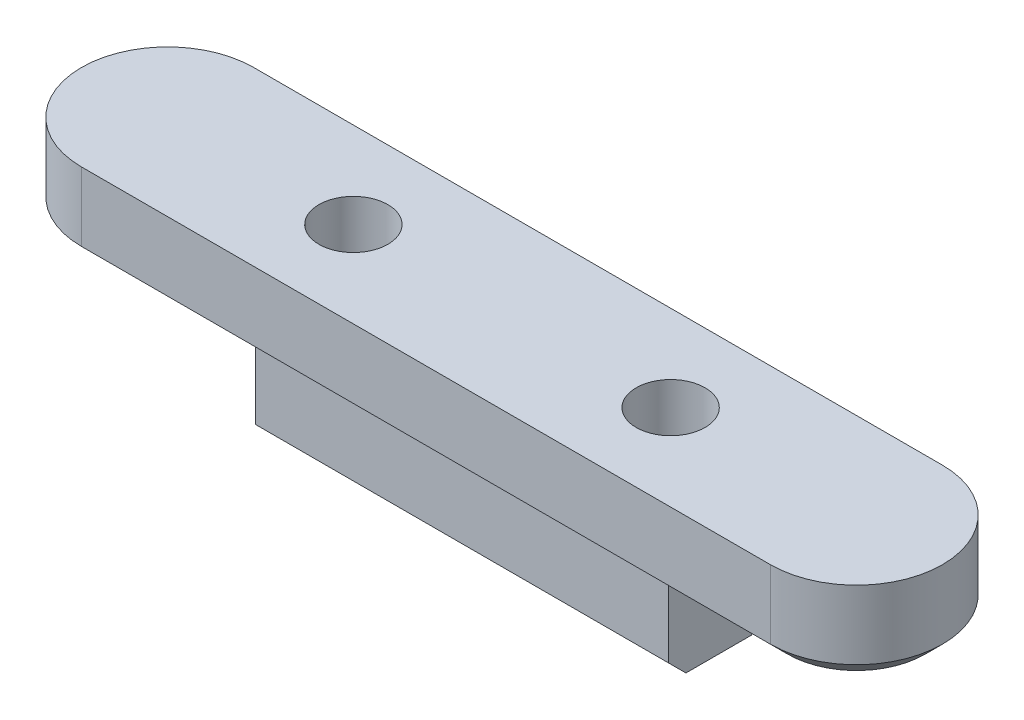
ISO-10303-21;
HEADER;
FILE_DESCRIPTION(('STEP AP214'),'2;1');
FILE_NAME('part.step','',(''),(''),'','','');
FILE_SCHEMA(('AUTOMOTIVE_DESIGN { 1 0 10303 214 1 1 1 1 }'));
ENDSEC;
DATA;
#1=APPLICATION_CONTEXT('core data for automotive mechanical design processes');
#2=APPLICATION_PROTOCOL_DEFINITION('international standard','automotive_design',2000,#1);
#3=PRODUCT_CONTEXT('',#1,'mechanical');
#4=PRODUCT('Part','Part','',(#3));
#5=PRODUCT_RELATED_PRODUCT_CATEGORY('part','',(#4));
#6=PRODUCT_DEFINITION_FORMATION('','',#4);
#7=PRODUCT_DEFINITION_CONTEXT('part definition',#1,'design');
#8=PRODUCT_DEFINITION('design','',#6,#7);
#9=PRODUCT_DEFINITION_SHAPE('','',#8);
#10=(LENGTH_UNIT() NAMED_UNIT(*) SI_UNIT(.MILLI.,.METRE.));
#11=(NAMED_UNIT(*) PLANE_ANGLE_UNIT() SI_UNIT($,.RADIAN.));
#12=(NAMED_UNIT(*) SI_UNIT($,.STERADIAN.) SOLID_ANGLE_UNIT());
#13=UNCERTAINTY_MEASURE_WITH_UNIT(LENGTH_MEASURE(1.E-05),#10,'distance_accuracy_value','');
#14=(GEOMETRIC_REPRESENTATION_CONTEXT(3) GLOBAL_UNCERTAINTY_ASSIGNED_CONTEXT((#13)) GLOBAL_UNIT_ASSIGNED_CONTEXT((#10,
#11,#12)) REPRESENTATION_CONTEXT('',''));
#15=CARTESIAN_POINT('',(0.,0.,0.));
#16=DIRECTION('',(0.,0.,1.));
#17=DIRECTION('',(1.,0.,0.));
#18=AXIS2_PLACEMENT_3D('',#15,#16,#17);
#19=CARTESIAN_POINT('',(-9.21061883419272,-6.,0.));
#20=DIRECTION('',(0.,1.,0.));
#21=DIRECTION('',(0.,0.,1.));
#22=AXIS2_PLACEMENT_3D('',#19,#20,#21);
#23=CYLINDRICAL_SURFACE('',#22,1.6);
#24=CARTESIAN_POINT('',(-9.21061883419272,-6.,0.));
#25=DIRECTION('',(0.,1.,0.));
#26=DIRECTION('',(0.,0.,1.));
#27=AXIS2_PLACEMENT_3D('',#24,#25,#26);
#28=CIRCLE('',#27,1.6);
#29=CARTESIAN_POINT('',(-9.21061883419272,-6.,1.6));
#30=VERTEX_POINT('',#29);
#31=EDGE_CURVE('E162',#30,#30,#28,.T.);
#32=ORIENTED_EDGE('',*,*,#31,.F.);
#33=EDGE_LOOP('',(#32));
#34=FACE_BOUND('',#33,.T.);
#35=CARTESIAN_POINT('',(-9.21061883419272,1.,0.));
#36=DIRECTION('',(0.,1.,0.));
#37=DIRECTION('',(0.,0.,1.));
#38=AXIS2_PLACEMENT_3D('',#35,#36,#37);
#39=CIRCLE('',#38,1.6);
#40=CARTESIAN_POINT('',(-9.21061883419272,1.,1.6));
#41=VERTEX_POINT('',#40);
#42=EDGE_CURVE('E204',#41,#41,#39,.F.);
#43=ORIENTED_EDGE('',*,*,#42,.F.);
#44=EDGE_LOOP('',(#43));
#45=FACE_BOUND('',#44,.T.);
#46=ADVANCED_FACE('F47',(#34,#45),#23,.F.);
#47=CARTESIAN_POINT('',(-20.,0.,0.));
#48=DIRECTION('',(0.,-1.,0.));
#49=DIRECTION('',(0.,0.,-1.));
#50=AXIS2_PLACEMENT_3D('',#47,#48,#49);
#51=PLANE('',#50);
#52=CARTESIAN_POINT('',(-20.,0.,0.));
#53=DIRECTION('',(0.,-1.,0.));
#54=DIRECTION('',(0.,0.,-1.));
#55=AXIS2_PLACEMENT_3D('',#52,#53,#54);
#56=CIRCLE('',#55,4.);
#57=CARTESIAN_POINT('',(-20.,0.,4.));
#58=VERTEX_POINT('',#57);
#59=CARTESIAN_POINT('',(-20.,0.,-3.99999999999999));
#60=VERTEX_POINT('',#59);
#61=EDGE_CURVE('E260',#58,#60,#56,.T.);
#62=ORIENTED_EDGE('',*,*,#61,.T.);
#63=DIRECTION('',(1.,0.,0.));
#64=VECTOR('',#63,1.);
#65=CARTESIAN_POINT('',(20.,0.,-4.));
#66=LINE('',#65,#64);
#67=CARTESIAN_POINT('',(20.,0.,-3.99999999999999));
#68=VERTEX_POINT('',#67);
#69=EDGE_CURVE('E263',#60,#68,#66,.T.);
#70=ORIENTED_EDGE('',*,*,#69,.T.);
#71=CARTESIAN_POINT('',(20.,0.,0.));
#72=DIRECTION('',(0.,-1.,0.));
#73=DIRECTION('',(0.,0.,-1.));
#74=AXIS2_PLACEMENT_3D('',#71,#72,#73);
#75=CIRCLE('',#74,4.);
#76=CARTESIAN_POINT('',(20.,0.,3.99999999999999));
#77=VERTEX_POINT('',#76);
#78=EDGE_CURVE('E257',#68,#77,#75,.T.);
#79=ORIENTED_EDGE('',*,*,#78,.T.);
#80=DIRECTION('',(-1.,0.,0.));
#81=VECTOR('',#80,1.);
#82=CARTESIAN_POINT('',(-20.,0.,4.));
#83=LINE('',#82,#81);
#84=EDGE_CURVE('E254',#77,#58,#83,.T.);
#85=ORIENTED_EDGE('',*,*,#84,.T.);
#86=EDGE_LOOP('',(#62,#70,#79,#85));
#87=FACE_BOUND('',#86,.T.);
#88=DIRECTION('',(-1.,0.,0.));
#89=VECTOR('',#88,1.);
#90=CARTESIAN_POINT('',(0.,0.,2.9));
#91=LINE('',#90,#89);
#92=CARTESIAN_POINT('',(12.,0.,2.9));
#93=VERTEX_POINT('',#92);
#94=CARTESIAN_POINT('',(-12.,0.,2.9));
#95=VERTEX_POINT('',#94);
#96=EDGE_CURVE('E143',#93,#95,#91,.T.);
#97=ORIENTED_EDGE('',*,*,#96,.F.);
#98=DIRECTION('',(0.,0.,-1.));
#99=VECTOR('',#98,1.);
#100=CARTESIAN_POINT('',(12.,0.,2.9));
#101=LINE('',#100,#99);
#102=CARTESIAN_POINT('',(12.,0.,-2.90000000000001));
#103=VERTEX_POINT('',#102);
#104=EDGE_CURVE('E158',#93,#103,#101,.T.);
#105=ORIENTED_EDGE('',*,*,#104,.T.);
#106=DIRECTION('',(1.,0.,0.));
#107=VECTOR('',#106,1.);
#108=CARTESIAN_POINT('',(0.,0.,-2.9));
#109=LINE('',#108,#107);
#110=CARTESIAN_POINT('',(-12.,0.,-2.90000000000001));
#111=VERTEX_POINT('',#110);
#112=EDGE_CURVE('E215',#111,#103,#109,.T.);
#113=ORIENTED_EDGE('',*,*,#112,.F.);
#114=DIRECTION('',(0.,0.,-1.));
#115=VECTOR('',#114,1.);
#116=CARTESIAN_POINT('',(-12.,0.,2.9));
#117=LINE('',#116,#115);
#118=EDGE_CURVE('E160',#95,#111,#117,.T.);
#119=ORIENTED_EDGE('',*,*,#118,.F.);
#120=EDGE_LOOP('',(#97,#105,#113,#119));
#121=FACE_BOUND('',#120,.T.);
#122=CARTESIAN_POINT('',(-20.,0.,0.));
#123=DIRECTION('',(0.,-1.,0.));
#124=DIRECTION('',(0.,0.,-1.));
#125=AXIS2_PLACEMENT_3D('',#122,#123,#124);
#126=CIRCLE('',#125,3.3166247903554);
#127=CARTESIAN_POINT('',(-20.,0.,-3.31662479035539));
#128=VERTEX_POINT('',#127);
#129=EDGE_CURVE('E226',#128,#128,#126,.T.);
#130=ORIENTED_EDGE('',*,*,#129,.F.);
#131=EDGE_LOOP('',(#130));
#132=FACE_BOUND('',#131,.T.);
#133=CARTESIAN_POINT('',(20.,0.,0.));
#134=DIRECTION('',(0.,1.,0.));
#135=DIRECTION('',(0.,0.,-1.));
#136=AXIS2_PLACEMENT_3D('',#133,#134,#135);
#137=CIRCLE('',#136,3.3166247903554);
#138=CARTESIAN_POINT('',(20.,0.,-3.31662479035539));
#139=VERTEX_POINT('',#138);
#140=EDGE_CURVE('E150',#139,#139,#137,.T.);
#141=ORIENTED_EDGE('',*,*,#140,.T.);
#142=EDGE_LOOP('',(#141));
#143=FACE_BOUND('',#142,.T.);
#144=ADVANCED_FACE('F155',(#87,#121,#132,#143),#51,.T.);
#145=CARTESIAN_POINT('',(0.,5.,-5.));
#146=DIRECTION('',(0.,0.,1.));
#147=DIRECTION('',(1.,0.,0.));
#148=AXIS2_PLACEMENT_3D('',#145,#146,#147);
#149=PLANE('',#148);
#150=DIRECTION('',(0.,-1.,0.));
#151=VECTOR('',#150,1.);
#152=CARTESIAN_POINT('',(20.,5.,-4.99999999999999));
#153=LINE('',#152,#151);
#154=CARTESIAN_POINT('',(20.,5.,-4.99999999999999));
#155=VERTEX_POINT('',#154);
#156=CARTESIAN_POINT('',(20.,1.,-4.99999999999999));
#157=VERTEX_POINT('',#156);
#158=EDGE_CURVE('E191',#155,#157,#153,.T.);
#159=ORIENTED_EDGE('',*,*,#158,.T.);
#160=DIRECTION('',(-1.,0.,0.));
#161=VECTOR('',#160,1.);
#162=CARTESIAN_POINT('',(-20.,1.,-4.99999999999999));
#163=LINE('',#162,#161);
#164=CARTESIAN_POINT('',(-20.,1.,-4.99999999999999));
#165=VERTEX_POINT('',#164);
#166=EDGE_CURVE('E247',#157,#165,#163,.T.);
#167=ORIENTED_EDGE('',*,*,#166,.T.);
#168=DIRECTION('',(0.,-1.,0.));
#169=VECTOR('',#168,1.);
#170=CARTESIAN_POINT('',(-20.,5.,-4.99999999999999));
#171=LINE('',#170,#169);
#172=CARTESIAN_POINT('',(-20.,5.,-4.99999999999999));
#173=VERTEX_POINT('',#172);
#174=EDGE_CURVE('E243',#173,#165,#171,.T.);
#175=ORIENTED_EDGE('',*,*,#174,.F.);
#176=DIRECTION('',(-1.,0.,0.));
#177=VECTOR('',#176,1.);
#178=CARTESIAN_POINT('',(0.,5.,-5.));
#179=LINE('',#178,#177);
#180=EDGE_CURVE('E230',#155,#173,#179,.T.);
#181=ORIENTED_EDGE('',*,*,#180,.F.);
#182=EDGE_LOOP('',(#159,#167,#175,#181));
#183=FACE_BOUND('',#182,.T.);
#184=ADVANCED_FACE('F362',(#183),#149,.F.);
#185=CARTESIAN_POINT('',(-20.,5.,0.));
#186=DIRECTION('',(0.,-1.,0.));
#187=DIRECTION('',(0.,0.,-1.));
#188=AXIS2_PLACEMENT_3D('',#185,#186,#187);
#189=CYLINDRICAL_SURFACE('',#188,5.);
#190=ORIENTED_EDGE('',*,*,#174,.T.);
#191=CARTESIAN_POINT('',(-20.,1.,0.));
#192=DIRECTION('',(0.,-1.,0.));
#193=DIRECTION('',(0.,0.,-1.));
#194=AXIS2_PLACEMENT_3D('',#191,#192,#193);
#195=CIRCLE('',#194,5.);
#196=CARTESIAN_POINT('',(-20.,1.,5.00000000000001));
#197=VERTEX_POINT('',#196);
#198=EDGE_CURVE('E267',#165,#197,#195,.F.);
#199=ORIENTED_EDGE('',*,*,#198,.T.);
#200=DIRECTION('',(0.,-1.,0.));
#201=VECTOR('',#200,1.);
#202=CARTESIAN_POINT('',(-20.,5.,5.00000000000001));
#203=LINE('',#202,#201);
#204=CARTESIAN_POINT('',(-20.,5.,5.00000000000001));
#205=VERTEX_POINT('',#204);
#206=EDGE_CURVE('E239',#205,#197,#203,.T.);
#207=ORIENTED_EDGE('',*,*,#206,.F.);
#208=CARTESIAN_POINT('',(-20.,5.,0.));
#209=DIRECTION('',(0.,1.,0.));
#210=DIRECTION('',(0.,0.,-1.));
#211=AXIS2_PLACEMENT_3D('',#208,#209,#210);
#212=CIRCLE('',#211,5.);
#213=EDGE_CURVE('E233',#173,#205,#212,.T.);
#214=ORIENTED_EDGE('',*,*,#213,.F.);
#215=EDGE_LOOP('',(#190,#199,#207,#214));
#216=FACE_BOUND('',#215,.T.);
#217=ADVANCED_FACE('F391',(#216),#189,.T.);
#218=CARTESIAN_POINT('',(-20.,5.,5.00000000000001));
#219=DIRECTION('',(0.,0.,-1.));
#220=DIRECTION('',(-1.,0.,0.));
#221=AXIS2_PLACEMENT_3D('',#218,#219,#220);
#222=PLANE('',#221);
#223=ORIENTED_EDGE('',*,*,#206,.T.);
#224=DIRECTION('',(1.,0.,0.));
#225=VECTOR('',#224,1.);
#226=CARTESIAN_POINT('',(20.,1.,4.99999999999999));
#227=LINE('',#226,#225);
#228=CARTESIAN_POINT('',(20.,1.,5.00000000000001));
#229=VERTEX_POINT('',#228);
#230=EDGE_CURVE('E273',#197,#229,#227,.T.);
#231=ORIENTED_EDGE('',*,*,#230,.T.);
#232=DIRECTION('',(0.,-1.,0.));
#233=VECTOR('',#232,1.);
#234=CARTESIAN_POINT('',(20.,5.,5.00000000000001));
#235=LINE('',#234,#233);
#236=CARTESIAN_POINT('',(20.,5.,5.00000000000001));
#237=VERTEX_POINT('',#236);
#238=EDGE_CURVE('E187',#237,#229,#235,.T.);
#239=ORIENTED_EDGE('',*,*,#238,.F.);
#240=DIRECTION('',(1.,0.,0.));
#241=VECTOR('',#240,1.);
#242=CARTESIAN_POINT('',(-20.,5.,5.00000000000001));
#243=LINE('',#242,#241);
#244=EDGE_CURVE('E236',#205,#237,#243,.T.);
#245=ORIENTED_EDGE('',*,*,#244,.F.);
#246=EDGE_LOOP('',(#223,#231,#239,#245));
#247=FACE_BOUND('',#246,.T.);
#248=ADVANCED_FACE('F386',(#247),#222,.F.);
#249=CARTESIAN_POINT('',(-20.,5.,0.));
#250=DIRECTION('',(0.,-1.,0.));
#251=DIRECTION('',(0.,0.,-1.));
#252=AXIS2_PLACEMENT_3D('',#249,#250,#251);
#253=PLANE('',#252);
#254=CARTESIAN_POINT('',(-9.21061883419272,5.,0.));
#255=DIRECTION('',(0.,1.,0.));
#256=DIRECTION('',(0.,0.,1.));
#257=AXIS2_PLACEMENT_3D('',#254,#255,#256);
#258=CIRCLE('',#257,2.);
#259=CARTESIAN_POINT('',(-9.21061883419272,5.,2.));
#260=VERTEX_POINT('',#259);
#261=EDGE_CURVE('E195',#260,#260,#258,.T.);
#262=ORIENTED_EDGE('',*,*,#261,.F.);
#263=EDGE_LOOP('',(#262));
#264=FACE_BOUND('',#263,.T.);
#265=ORIENTED_EDGE('',*,*,#244,.T.);
#266=CARTESIAN_POINT('',(20.,5.,0.));
#267=DIRECTION('',(0.,-1.,0.));
#268=DIRECTION('',(0.,0.,-1.));
#269=AXIS2_PLACEMENT_3D('',#266,#267,#268);
#270=CIRCLE('',#269,5.);
#271=EDGE_CURVE('E183',#155,#237,#270,.T.);
#272=ORIENTED_EDGE('',*,*,#271,.F.);
#273=ORIENTED_EDGE('',*,*,#180,.T.);
#274=ORIENTED_EDGE('',*,*,#213,.T.);
#275=EDGE_LOOP('',(#265,#272,#273,#274));
#276=FACE_BOUND('',#275,.T.);
#277=CARTESIAN_POINT('',(9.21061883419272,5.,0.));
#278=DIRECTION('',(0.,-1.,0.));
#279=DIRECTION('',(0.,0.,1.));
#280=AXIS2_PLACEMENT_3D('',#277,#278,#279);
#281=CIRCLE('',#280,2.);
#282=CARTESIAN_POINT('',(9.21061883419272,5.,2.));
#283=VERTEX_POINT('',#282);
#284=EDGE_CURVE('E310',#283,#283,#281,.T.);
#285=ORIENTED_EDGE('',*,*,#284,.T.);
#286=EDGE_LOOP('',(#285));
#287=FACE_BOUND('',#286,.T.);
#288=ADVANCED_FACE('F384',(#264,#276,#287),#253,.F.);
#289=CARTESIAN_POINT('',(-20.,-5.,0.));
#290=DIRECTION('',(0.,-1.,0.));
#291=DIRECTION('',(-1.,0.,0.));
#292=AXIS2_PLACEMENT_3D('',#289,#290,#291);
#293=SPHERICAL_SURFACE('',#292,6.);
#294=ORIENTED_EDGE('',*,*,#129,.T.);
#295=EDGE_LOOP('',(#294));
#296=FACE_BOUND('',#295,.T.);
#297=ADVANCED_FACE('F381',(#296),#293,.F.);
#298=CARTESIAN_POINT('',(0.,-6.,2.9));
#299=DIRECTION('',(0.,0.,-1.));
#300=DIRECTION('',(-1.,0.,0.));
#301=AXIS2_PLACEMENT_3D('',#298,#299,#300);
#302=PLANE('',#301);
#303=DIRECTION('',(0.,1.,0.));
#304=VECTOR('',#303,1.);
#305=CARTESIAN_POINT('',(-12.,-6.,2.9));
#306=LINE('',#305,#304);
#307=CARTESIAN_POINT('',(-12.,-5.,2.9));
#308=VERTEX_POINT('',#307);
#309=EDGE_CURVE('E223',#308,#95,#306,.T.);
#310=ORIENTED_EDGE('',*,*,#309,.F.);
#311=DIRECTION('',(1.,0.,0.));
#312=VECTOR('',#311,1.);
#313=CARTESIAN_POINT('',(0.,-5.,2.9));
#314=LINE('',#313,#312);
#315=CARTESIAN_POINT('',(12.,-5.,2.9));
#316=VERTEX_POINT('',#315);
#317=EDGE_CURVE('E11',#308,#316,#314,.T.);
#318=ORIENTED_EDGE('',*,*,#317,.T.);
#319=DIRECTION('',(0.,1.,0.));
#320=VECTOR('',#319,1.);
#321=CARTESIAN_POINT('',(12.,-6.,2.9));
#322=LINE('',#321,#320);
#323=EDGE_CURVE('E140',#316,#93,#322,.T.);
#324=ORIENTED_EDGE('',*,*,#323,.T.);
#325=ORIENTED_EDGE('',*,*,#96,.T.);
#326=EDGE_LOOP('',(#310,#318,#324,#325));
#327=FACE_BOUND('',#326,.T.);
#328=ADVANCED_FACE('F142',(#327),#302,.F.);
#329=CARTESIAN_POINT('',(-12.,-6.,2.9));
#330=DIRECTION('',(1.,0.,0.));
#331=DIRECTION('',(0.,0.,-1.));
#332=AXIS2_PLACEMENT_3D('',#329,#330,#331);
#333=PLANE('',#332);
#334=DIRECTION('',(0.,1.,0.));
#335=VECTOR('',#334,1.);
#336=CARTESIAN_POINT('',(-12.,-6.,-2.90000000000001));
#337=LINE('',#336,#335);
#338=CARTESIAN_POINT('',(-12.,-5.,-2.90000000000001));
#339=VERTEX_POINT('',#338);
#340=EDGE_CURVE('E214',#339,#111,#337,.T.);
#341=ORIENTED_EDGE('',*,*,#340,.F.);
#342=DIRECTION('',(0.,0.707106781186548,-0.707106781186548));
#343=VECTOR('',#342,1.);
#344=CARTESIAN_POINT('',(-12.,-6.,-1.90000000000001));
#345=LINE('',#344,#343);
#346=CARTESIAN_POINT('',(-12.,-6.,-1.90000000000001));
#347=VERTEX_POINT('',#346);
#348=EDGE_CURVE('E58',#339,#347,#345,.F.);
#349=ORIENTED_EDGE('',*,*,#348,.T.);
#350=DIRECTION('',(0.,0.,-1.));
#351=VECTOR('',#350,1.);
#352=CARTESIAN_POINT('',(-12.,-6.,2.9));
#353=LINE('',#352,#351);
#354=CARTESIAN_POINT('',(-12.,-6.,1.9));
#355=VERTEX_POINT('',#354);
#356=EDGE_CURVE('E211',#355,#347,#353,.T.);
#357=ORIENTED_EDGE('',*,*,#356,.F.);
#358=DIRECTION('',(0.,-0.707106781186548,-0.707106781186548));
#359=VECTOR('',#358,1.);
#360=CARTESIAN_POINT('',(-12.,-6.,1.9));
#361=LINE('',#360,#359);
#362=EDGE_CURVE('E66',#355,#308,#361,.F.);
#363=ORIENTED_EDGE('',*,*,#362,.T.);
#364=ORIENTED_EDGE('',*,*,#309,.T.);
#365=ORIENTED_EDGE('',*,*,#118,.T.);
#366=EDGE_LOOP('',(#341,#349,#357,#363,#364,#365));
#367=FACE_BOUND('',#366,.T.);
#368=ADVANCED_FACE('F376',(#367),#333,.F.);
#369=CARTESIAN_POINT('',(0.,-6.,-2.9));
#370=DIRECTION('',(0.,0.,1.));
#371=DIRECTION('',(1.,0.,0.));
#372=AXIS2_PLACEMENT_3D('',#369,#370,#371);
#373=PLANE('',#372);
#374=DIRECTION('',(0.,1.,0.));
#375=VECTOR('',#374,1.);
#376=CARTESIAN_POINT('',(12.,-6.,-2.90000000000001));
#377=LINE('',#376,#375);
#378=CARTESIAN_POINT('',(12.,-5.,-2.90000000000001));
#379=VERTEX_POINT('',#378);
#380=EDGE_CURVE('E151',#379,#103,#377,.T.);
#381=ORIENTED_EDGE('',*,*,#380,.F.);
#382=DIRECTION('',(-1.,0.,0.));
#383=VECTOR('',#382,1.);
#384=CARTESIAN_POINT('',(0.,-5.,-2.9));
#385=LINE('',#384,#383);
#386=EDGE_CURVE('E74',#379,#339,#385,.T.);
#387=ORIENTED_EDGE('',*,*,#386,.T.);
#388=ORIENTED_EDGE('',*,*,#340,.T.);
#389=ORIENTED_EDGE('',*,*,#112,.T.);
#390=EDGE_LOOP('',(#381,#387,#388,#389));
#391=FACE_BOUND('',#390,.T.);
#392=ADVANCED_FACE('F372',(#391),#373,.F.);
#393=CARTESIAN_POINT('',(0.,-6.,0.));
#394=DIRECTION('',(0.,1.,0.));
#395=DIRECTION('',(0.,0.,1.));
#396=AXIS2_PLACEMENT_3D('',#393,#394,#395);
#397=PLANE('',#396);
#398=ORIENTED_EDGE('',*,*,#31,.T.);
#399=EDGE_LOOP('',(#398));
#400=FACE_BOUND('',#399,.T.);
#401=ORIENTED_EDGE('',*,*,#356,.T.);
#402=DIRECTION('',(1.,0.,0.));
#403=VECTOR('',#402,1.);
#404=CARTESIAN_POINT('',(0.,-6.,-1.9));
#405=LINE('',#404,#403);
#406=CARTESIAN_POINT('',(12.,-6.,-1.9));
#407=VERTEX_POINT('',#406);
#408=EDGE_CURVE('E280',#347,#407,#405,.T.);
#409=ORIENTED_EDGE('',*,*,#408,.T.);
#410=DIRECTION('',(0.,0.,-1.));
#411=VECTOR('',#410,1.);
#412=CARTESIAN_POINT('',(12.,-6.,2.9));
#413=LINE('',#412,#411);
#414=CARTESIAN_POINT('',(12.,-6.,1.90000000000001));
#415=VERTEX_POINT('',#414);
#416=EDGE_CURVE('E168',#415,#407,#413,.T.);
#417=ORIENTED_EDGE('',*,*,#416,.F.);
#418=DIRECTION('',(-1.,0.,0.));
#419=VECTOR('',#418,1.);
#420=CARTESIAN_POINT('',(0.,-6.,1.9));
#421=LINE('',#420,#419);
#422=EDGE_CURVE('E276',#415,#355,#421,.T.);
#423=ORIENTED_EDGE('',*,*,#422,.T.);
#424=EDGE_LOOP('',(#401,#409,#417,#423));
#425=FACE_BOUND('',#424,.T.);
#426=CARTESIAN_POINT('',(9.21061883419272,-6.,0.));
#427=DIRECTION('',(0.,-1.,0.));
#428=DIRECTION('',(0.,0.,1.));
#429=AXIS2_PLACEMENT_3D('',#426,#427,#428);
#430=CIRCLE('',#429,1.6);
#431=CARTESIAN_POINT('',(9.21061883419272,-6.,1.6));
#432=VERTEX_POINT('',#431);
#433=EDGE_CURVE('E169',#432,#432,#430,.T.);
#434=ORIENTED_EDGE('',*,*,#433,.F.);
#435=EDGE_LOOP('',(#434));
#436=FACE_BOUND('',#435,.T.);
#437=ADVANCED_FACE('F369',(#400,#425,#436),#397,.F.);
#438=CARTESIAN_POINT('',(-9.21061883419272,1.,0.));
#439=DIRECTION('',(0.,1.,0.));
#440=DIRECTION('',(0.,0.,1.));
#441=AXIS2_PLACEMENT_3D('',#438,#439,#440);
#442=PLANE('',#441);
#443=CARTESIAN_POINT('',(-9.21061883419272,1.,0.));
#444=DIRECTION('',(0.,1.,0.));
#445=DIRECTION('',(0.,0.,1.));
#446=AXIS2_PLACEMENT_3D('',#443,#444,#445);
#447=CIRCLE('',#446,2.);
#448=CARTESIAN_POINT('',(-9.21061883419272,1.,2.));
#449=VERTEX_POINT('',#448);
#450=EDGE_CURVE('E200',#449,#449,#447,.T.);
#451=ORIENTED_EDGE('',*,*,#450,.T.);
#452=EDGE_LOOP('',(#451));
#453=FACE_BOUND('',#452,.T.);
#454=ORIENTED_EDGE('',*,*,#42,.T.);
#455=EDGE_LOOP('',(#454));
#456=FACE_BOUND('',#455,.T.);
#457=ADVANCED_FACE('F349',(#453,#456),#442,.T.);
#458=CARTESIAN_POINT('',(-9.21061883419272,1.,0.));
#459=DIRECTION('',(0.,1.,0.));
#460=DIRECTION('',(0.,0.,1.));
#461=AXIS2_PLACEMENT_3D('',#458,#459,#460);
#462=CYLINDRICAL_SURFACE('',#461,2.);
#463=ORIENTED_EDGE('',*,*,#450,.F.);
#464=EDGE_LOOP('',(#463));
#465=FACE_BOUND('',#464,.T.);
#466=ORIENTED_EDGE('',*,*,#261,.T.);
#467=EDGE_LOOP('',(#466));
#468=FACE_BOUND('',#467,.T.);
#469=ADVANCED_FACE('F337',(#465,#468),#462,.F.);
#470=CARTESIAN_POINT('',(9.21061883419272,-6.,0.));
#471=DIRECTION('',(0.,1.,0.));
#472=DIRECTION('',(0.,0.,1.));
#473=AXIS2_PLACEMENT_3D('',#470,#471,#472);
#474=CYLINDRICAL_SURFACE('',#473,1.6);
#475=ORIENTED_EDGE('',*,*,#433,.T.);
#476=EDGE_LOOP('',(#475));
#477=FACE_BOUND('',#476,.T.);
#478=CARTESIAN_POINT('',(9.21061883419272,1.,0.));
#479=DIRECTION('',(0.,-1.,0.));
#480=DIRECTION('',(0.,0.,1.));
#481=AXIS2_PLACEMENT_3D('',#478,#479,#480);
#482=CIRCLE('',#481,1.6);
#483=CARTESIAN_POINT('',(9.21061883419272,1.,1.6));
#484=VERTEX_POINT('',#483);
#485=EDGE_CURVE('E175',#484,#484,#482,.F.);
#486=ORIENTED_EDGE('',*,*,#485,.T.);
#487=EDGE_LOOP('',(#486));
#488=FACE_BOUND('',#487,.T.);
#489=ADVANCED_FACE('F334',(#477,#488),#474,.F.);
#490=CARTESIAN_POINT('',(20.,5.,0.));
#491=DIRECTION('',(0.,-1.,0.));
#492=DIRECTION('',(0.,0.,-1.));
#493=AXIS2_PLACEMENT_3D('',#490,#491,#492);
#494=CYLINDRICAL_SURFACE('',#493,5.);
#495=ORIENTED_EDGE('',*,*,#238,.T.);
#496=CARTESIAN_POINT('',(20.,1.,0.));
#497=DIRECTION('',(0.,-1.,0.));
#498=DIRECTION('',(0.,0.,-1.));
#499=AXIS2_PLACEMENT_3D('',#496,#497,#498);
#500=CIRCLE('',#499,5.);
#501=EDGE_CURVE('E270',#229,#157,#500,.F.);
#502=ORIENTED_EDGE('',*,*,#501,.T.);
#503=ORIENTED_EDGE('',*,*,#158,.F.);
#504=ORIENTED_EDGE('',*,*,#271,.T.);
#505=EDGE_LOOP('',(#495,#502,#503,#504));
#506=FACE_BOUND('',#505,.T.);
#507=ADVANCED_FACE('F336',(#506),#494,.T.);
#508=CARTESIAN_POINT('',(20.,-5.,0.));
#509=DIRECTION('',(0.,-1.,0.));
#510=DIRECTION('',(1.,0.,0.));
#511=AXIS2_PLACEMENT_3D('',#508,#509,#510);
#512=SPHERICAL_SURFACE('',#511,6.);
#513=ORIENTED_EDGE('',*,*,#140,.F.);
#514=EDGE_LOOP('',(#513));
#515=FACE_BOUND('',#514,.T.);
#516=ADVANCED_FACE('F345',(#515),#512,.F.);
#517=CARTESIAN_POINT('',(12.,-6.,2.9));
#518=DIRECTION('',(-1.,0.,0.));
#519=DIRECTION('',(0.,0.,-1.));
#520=AXIS2_PLACEMENT_3D('',#517,#518,#519);
#521=PLANE('',#520);
#522=ORIENTED_EDGE('',*,*,#416,.T.);
#523=DIRECTION('',(0.,-0.707106781186548,0.707106781186548));
#524=VECTOR('',#523,1.);
#525=CARTESIAN_POINT('',(12.,-6.,-1.90000000000001));
#526=LINE('',#525,#524);
#527=EDGE_CURVE('E287',#407,#379,#526,.F.);
#528=ORIENTED_EDGE('',*,*,#527,.T.);
#529=ORIENTED_EDGE('',*,*,#380,.T.);
#530=ORIENTED_EDGE('',*,*,#104,.F.);
#531=ORIENTED_EDGE('',*,*,#323,.F.);
#532=DIRECTION('',(0.,0.707106781186548,0.707106781186548));
#533=VECTOR('',#532,1.);
#534=CARTESIAN_POINT('',(12.,-6.,1.9));
#535=LINE('',#534,#533);
#536=EDGE_CURVE('E284',#316,#415,#535,.F.);
#537=ORIENTED_EDGE('',*,*,#536,.T.);
#538=EDGE_LOOP('',(#522,#528,#529,#530,#531,#537));
#539=FACE_BOUND('',#538,.T.);
#540=ADVANCED_FACE('F165',(#539),#521,.F.);
#541=CARTESIAN_POINT('',(9.21061883419272,1.,0.));
#542=DIRECTION('',(0.,1.,0.));
#543=DIRECTION('',(0.,0.,1.));
#544=AXIS2_PLACEMENT_3D('',#541,#542,#543);
#545=PLANE('',#544);
#546=CARTESIAN_POINT('',(9.21061883419272,1.,0.));
#547=DIRECTION('',(0.,-1.,0.));
#548=DIRECTION('',(0.,0.,1.));
#549=AXIS2_PLACEMENT_3D('',#546,#547,#548);
#550=CIRCLE('',#549,2.);
#551=CARTESIAN_POINT('',(9.21061883419272,1.,2.));
#552=VERTEX_POINT('',#551);
#553=EDGE_CURVE('E199',#552,#552,#550,.T.);
#554=ORIENTED_EDGE('',*,*,#553,.F.);
#555=EDGE_LOOP('',(#554));
#556=FACE_BOUND('',#555,.T.);
#557=ORIENTED_EDGE('',*,*,#485,.F.);
#558=EDGE_LOOP('',(#557));
#559=FACE_BOUND('',#558,.T.);
#560=ADVANCED_FACE('F328',(#556,#559),#545,.T.);
#561=CARTESIAN_POINT('',(9.21061883419272,1.,0.));
#562=DIRECTION('',(0.,1.,0.));
#563=DIRECTION('',(0.,0.,1.));
#564=AXIS2_PLACEMENT_3D('',#561,#562,#563);
#565=CYLINDRICAL_SURFACE('',#564,2.);
#566=ORIENTED_EDGE('',*,*,#553,.T.);
#567=EDGE_LOOP('',(#566));
#568=FACE_BOUND('',#567,.T.);
#569=ORIENTED_EDGE('',*,*,#284,.F.);
#570=EDGE_LOOP('',(#569));
#571=FACE_BOUND('',#570,.T.);
#572=ADVANCED_FACE('F325',(#568,#571),#565,.F.);
#573=CARTESIAN_POINT('',(-20.,1.,5.00000000000001));
#574=DIRECTION('',(0.,-0.707106781186547,0.707106781186547));
#575=DIRECTION('',(-1.,0.,0.));
#576=AXIS2_PLACEMENT_3D('',#573,#574,#575);
#577=PLANE('',#576);
#578=DIRECTION('',(0.,0.707106781186547,0.707106781186547));
#579=VECTOR('',#578,1.);
#580=CARTESIAN_POINT('',(-20.,0.,4.));
#581=LINE('',#580,#579);
#582=EDGE_CURVE('E301',#58,#197,#581,.T.);
#583=ORIENTED_EDGE('',*,*,#582,.F.);
#584=ORIENTED_EDGE('',*,*,#84,.F.);
#585=DIRECTION('',(0.,-0.707106781186547,-0.707106781186547));
#586=VECTOR('',#585,1.);
#587=CARTESIAN_POINT('',(20.,1.,4.99999999999999));
#588=LINE('',#587,#586);
#589=EDGE_CURVE('E52',#229,#77,#588,.T.);
#590=ORIENTED_EDGE('',*,*,#589,.F.);
#591=ORIENTED_EDGE('',*,*,#230,.F.);
#592=EDGE_LOOP('',(#583,#584,#590,#591));
#593=FACE_BOUND('',#592,.T.);
#594=ADVANCED_FACE('F421',(#593),#577,.T.);
#595=CARTESIAN_POINT('',(20.,0.,0.));
#596=DIRECTION('',(0.,1.,0.));
#597=DIRECTION('',(0.,0.,1.));
#598=AXIS2_PLACEMENT_3D('',#595,#596,#597);
#599=CONICAL_SURFACE('',#598,4.,0.785398163397448);
#600=ORIENTED_EDGE('',*,*,#589,.T.);
#601=ORIENTED_EDGE('',*,*,#78,.F.);
#602=DIRECTION('',(0.,-0.707106781186547,0.707106781186547));
#603=VECTOR('',#602,1.);
#604=CARTESIAN_POINT('',(20.,1.,-4.99999999999999));
#605=LINE('',#604,#603);
#606=EDGE_CURVE('E299',#157,#68,#605,.T.);
#607=ORIENTED_EDGE('',*,*,#606,.F.);
#608=ORIENTED_EDGE('',*,*,#501,.F.);
#609=EDGE_LOOP('',(#600,#601,#607,#608));
#610=FACE_BOUND('',#609,.T.);
#611=ADVANCED_FACE('F415',(#610),#599,.T.);
#612=CARTESIAN_POINT('',(-20.,1.,0.));
#613=DIRECTION('',(0.,1.,0.));
#614=DIRECTION('',(0.,0.,1.));
#615=AXIS2_PLACEMENT_3D('',#612,#613,#614);
#616=CONICAL_SURFACE('',#615,5.,0.785398163397448);
#617=ORIENTED_EDGE('',*,*,#582,.T.);
#618=ORIENTED_EDGE('',*,*,#198,.F.);
#619=DIRECTION('',(0.,0.707106781186547,-0.707106781186547));
#620=VECTOR('',#619,1.);
#621=CARTESIAN_POINT('',(-20.,0.,-3.99999999999999));
#622=LINE('',#621,#620);
#623=EDGE_CURVE('E296',#60,#165,#622,.T.);
#624=ORIENTED_EDGE('',*,*,#623,.F.);
#625=ORIENTED_EDGE('',*,*,#61,.F.);
#626=EDGE_LOOP('',(#617,#618,#624,#625));
#627=FACE_BOUND('',#626,.T.);
#628=ADVANCED_FACE('F408',(#627),#616,.T.);
#629=CARTESIAN_POINT('',(0.,1.,-5.));
#630=DIRECTION('',(0.,-0.707106781186547,-0.707106781186547));
#631=DIRECTION('',(1.,0.,0.));
#632=AXIS2_PLACEMENT_3D('',#629,#630,#631);
#633=PLANE('',#632);
#634=ORIENTED_EDGE('',*,*,#606,.T.);
#635=ORIENTED_EDGE('',*,*,#69,.F.);
#636=ORIENTED_EDGE('',*,*,#623,.T.);
#637=ORIENTED_EDGE('',*,*,#166,.F.);
#638=EDGE_LOOP('',(#634,#635,#636,#637));
#639=FACE_BOUND('',#638,.T.);
#640=ADVANCED_FACE('F400',(#639),#633,.T.);
#641=CARTESIAN_POINT('',(0.,-6.,-1.9));
#642=DIRECTION('',(0.,0.707106781186547,0.707106781186547));
#643=DIRECTION('',(1.,0.,0.));
#644=AXIS2_PLACEMENT_3D('',#641,#642,#643);
#645=PLANE('',#644);
#646=ORIENTED_EDGE('',*,*,#348,.F.);
#647=ORIENTED_EDGE('',*,*,#386,.F.);
#648=ORIENTED_EDGE('',*,*,#527,.F.);
#649=ORIENTED_EDGE('',*,*,#408,.F.);
#650=EDGE_LOOP('',(#646,#647,#648,#649));
#651=FACE_BOUND('',#650,.T.);
#652=ADVANCED_FACE('F407',(#651),#645,.F.);
#653=CARTESIAN_POINT('',(0.,-6.,1.9));
#654=DIRECTION('',(0.,0.707106781186547,-0.707106781186547));
#655=DIRECTION('',(-1.,0.,0.));
#656=AXIS2_PLACEMENT_3D('',#653,#654,#655);
#657=PLANE('',#656);
#658=ORIENTED_EDGE('',*,*,#536,.F.);
#659=ORIENTED_EDGE('',*,*,#317,.F.);
#660=ORIENTED_EDGE('',*,*,#362,.F.);
#661=ORIENTED_EDGE('',*,*,#422,.F.);
#662=EDGE_LOOP('',(#658,#659,#660,#661));
#663=FACE_BOUND('',#662,.T.);
#664=ADVANCED_FACE('F50',(#663),#657,.F.);
#665=CLOSED_SHELL('',(#46,#144,#184,#217,#248,#288,#297,#328,#368,#392,#437,#457,#469,#489,#507,
#516,#540,#560,#572,#594,#611,#628,#640,#652,#664));
#666=MANIFOLD_SOLID_BREP('B2',#665);
#667=ADVANCED_BREP_SHAPE_REPRESENTATION('',(#18,#666),#14);
#668=SHAPE_DEFINITION_REPRESENTATION(#9,#667);
ENDSEC;
END-ISO-10303-21;
